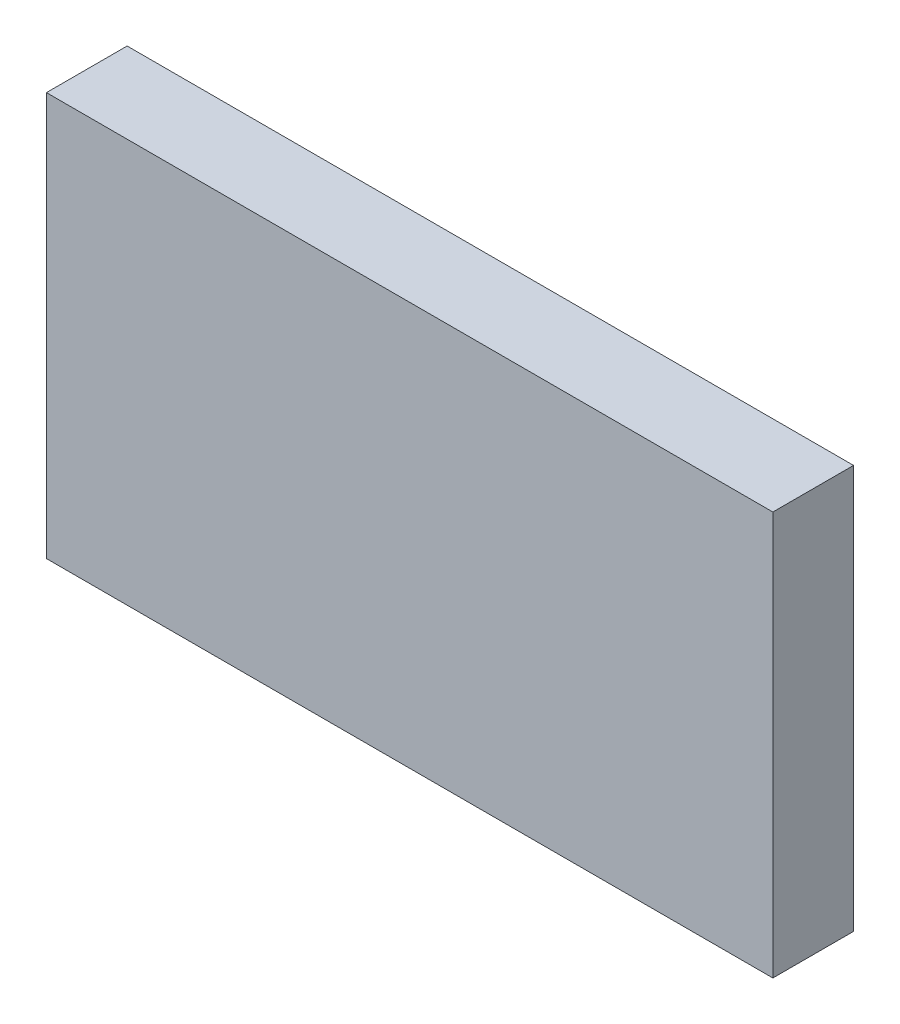
ISO-10303-21;
HEADER;
FILE_DESCRIPTION(('STEP AP214'),'2;1');
FILE_NAME('part.step','',(''),(''),'','','');
FILE_SCHEMA(('AUTOMOTIVE_DESIGN { 1 0 10303 214 1 1 1 1 }'));
ENDSEC;
DATA;
#1=APPLICATION_CONTEXT('core data for automotive mechanical design processes');
#2=APPLICATION_PROTOCOL_DEFINITION('international standard','automotive_design',2000,#1);
#3=PRODUCT_CONTEXT('',#1,'mechanical');
#4=PRODUCT('Part','Part','',(#3));
#5=PRODUCT_RELATED_PRODUCT_CATEGORY('part','',(#4));
#6=PRODUCT_DEFINITION_FORMATION('','',#4);
#7=PRODUCT_DEFINITION_CONTEXT('part definition',#1,'design');
#8=PRODUCT_DEFINITION('design','',#6,#7);
#9=PRODUCT_DEFINITION_SHAPE('','',#8);
#10=(LENGTH_UNIT() NAMED_UNIT(*) SI_UNIT(.MILLI.,.METRE.));
#11=(NAMED_UNIT(*) PLANE_ANGLE_UNIT() SI_UNIT($,.RADIAN.));
#12=(NAMED_UNIT(*) SI_UNIT($,.STERADIAN.) SOLID_ANGLE_UNIT());
#13=UNCERTAINTY_MEASURE_WITH_UNIT(LENGTH_MEASURE(1.E-05),#10,'distance_accuracy_value','');
#14=(GEOMETRIC_REPRESENTATION_CONTEXT(3) GLOBAL_UNCERTAINTY_ASSIGNED_CONTEXT((#13)) GLOBAL_UNIT_ASSIGNED_CONTEXT((#10,
#11,#12)) REPRESENTATION_CONTEXT('',''));
#15=CARTESIAN_POINT('',(0.,0.,0.));
#16=DIRECTION('',(0.,0.,1.));
#17=DIRECTION('',(1.,0.,0.));
#18=AXIS2_PLACEMENT_3D('',#15,#16,#17);
#19=CARTESIAN_POINT('',(0.,0.,10.));
#20=DIRECTION('',(1.,0.,0.));
#21=DIRECTION('',(0.,0.,-1.));
#22=AXIS2_PLACEMENT_3D('',#19,#20,#21);
#23=PLANE('',#22);
#24=DIRECTION('',(0.,-1.,0.));
#25=VECTOR('',#24,1.);
#26=CARTESIAN_POINT('',(0.,0.,0.));
#27=LINE('',#26,#25);
#28=CARTESIAN_POINT('',(0.,50.,0.));
#29=VERTEX_POINT('',#28);
#30=CARTESIAN_POINT('',(0.,0.,0.));
#31=VERTEX_POINT('',#30);
#32=EDGE_CURVE('E96',#29,#31,#27,.T.);
#33=ORIENTED_EDGE('',*,*,#32,.T.);
#34=DIRECTION('',(0.,0.,-1.));
#35=VECTOR('',#34,1.);
#36=CARTESIAN_POINT('',(0.,0.,10.));
#37=LINE('',#36,#35);
#38=CARTESIAN_POINT('',(0.,0.,10.));
#39=VERTEX_POINT('',#38);
#40=EDGE_CURVE('E11',#39,#31,#37,.T.);
#41=ORIENTED_EDGE('',*,*,#40,.F.);
#42=DIRECTION('',(0.,-1.,0.));
#43=VECTOR('',#42,1.);
#44=CARTESIAN_POINT('',(0.,0.,10.));
#45=LINE('',#44,#43);
#46=CARTESIAN_POINT('',(0.,50.,10.));
#47=VERTEX_POINT('',#46);
#48=EDGE_CURVE('E84',#47,#39,#45,.T.);
#49=ORIENTED_EDGE('',*,*,#48,.F.);
#50=DIRECTION('',(0.,0.,-1.));
#51=VECTOR('',#50,1.);
#52=CARTESIAN_POINT('',(0.,50.,10.));
#53=LINE('',#52,#51);
#54=EDGE_CURVE('E92',#47,#29,#53,.T.);
#55=ORIENTED_EDGE('',*,*,#54,.T.);
#56=EDGE_LOOP('',(#33,#41,#49,#55));
#57=FACE_BOUND('',#56,.T.);
#58=ADVANCED_FACE('F33',(#57),#23,.F.);
#59=CARTESIAN_POINT('',(0.,0.,10.));
#60=DIRECTION('',(0.,1.,0.));
#61=DIRECTION('',(0.,0.,1.));
#62=AXIS2_PLACEMENT_3D('',#59,#60,#61);
#63=PLANE('',#62);
#64=DIRECTION('',(1.,0.,0.));
#65=VECTOR('',#64,1.);
#66=CARTESIAN_POINT('',(0.,0.,0.));
#67=LINE('',#66,#65);
#68=CARTESIAN_POINT('',(90.,0.,0.));
#69=VERTEX_POINT('',#68);
#70=EDGE_CURVE('E88',#31,#69,#67,.T.);
#71=ORIENTED_EDGE('',*,*,#70,.T.);
#72=DIRECTION('',(0.,0.,-1.));
#73=VECTOR('',#72,1.);
#74=CARTESIAN_POINT('',(90.,0.,10.));
#75=LINE('',#74,#73);
#76=CARTESIAN_POINT('',(90.,0.,10.));
#77=VERTEX_POINT('',#76);
#78=EDGE_CURVE('E41',#77,#69,#75,.T.);
#79=ORIENTED_EDGE('',*,*,#78,.F.);
#80=DIRECTION('',(1.,0.,0.));
#81=VECTOR('',#80,1.);
#82=CARTESIAN_POINT('',(0.,0.,10.));
#83=LINE('',#82,#81);
#84=EDGE_CURVE('E79',#39,#77,#83,.T.);
#85=ORIENTED_EDGE('',*,*,#84,.F.);
#86=ORIENTED_EDGE('',*,*,#40,.T.);
#87=EDGE_LOOP('',(#71,#79,#85,#86));
#88=FACE_BOUND('',#87,.T.);
#89=ADVANCED_FACE('F87',(#88),#63,.F.);
#90=CARTESIAN_POINT('',(90.,0.,10.));
#91=DIRECTION('',(-1.,0.,0.));
#92=DIRECTION('',(0.,0.,1.));
#93=AXIS2_PLACEMENT_3D('',#90,#91,#92);
#94=PLANE('',#93);
#95=DIRECTION('',(0.,1.,0.));
#96=VECTOR('',#95,1.);
#97=CARTESIAN_POINT('',(90.,0.,0.));
#98=LINE('',#97,#96);
#99=CARTESIAN_POINT('',(90.,50.,0.));
#100=VERTEX_POINT('',#99);
#101=EDGE_CURVE('E66',#69,#100,#98,.T.);
#102=ORIENTED_EDGE('',*,*,#101,.T.);
#103=DIRECTION('',(0.,0.,-1.));
#104=VECTOR('',#103,1.);
#105=CARTESIAN_POINT('',(90.,50.,10.));
#106=LINE('',#105,#104);
#107=CARTESIAN_POINT('',(90.,50.,10.));
#108=VERTEX_POINT('',#107);
#109=EDGE_CURVE('E89',#108,#100,#106,.T.);
#110=ORIENTED_EDGE('',*,*,#109,.F.);
#111=DIRECTION('',(0.,1.,0.));
#112=VECTOR('',#111,1.);
#113=CARTESIAN_POINT('',(90.,0.,10.));
#114=LINE('',#113,#112);
#115=EDGE_CURVE('E82',#77,#108,#114,.T.);
#116=ORIENTED_EDGE('',*,*,#115,.F.);
#117=ORIENTED_EDGE('',*,*,#78,.T.);
#118=EDGE_LOOP('',(#102,#110,#116,#117));
#119=FACE_BOUND('',#118,.T.);
#120=ADVANCED_FACE('F90',(#119),#94,.F.);
#121=CARTESIAN_POINT('',(0.,50.,10.));
#122=DIRECTION('',(0.,-1.,0.));
#123=DIRECTION('',(0.,0.,-1.));
#124=AXIS2_PLACEMENT_3D('',#121,#122,#123);
#125=PLANE('',#124);
#126=DIRECTION('',(-1.,0.,0.));
#127=VECTOR('',#126,1.);
#128=CARTESIAN_POINT('',(0.,50.,0.));
#129=LINE('',#128,#127);
#130=EDGE_CURVE('E72',#100,#29,#129,.T.);
#131=ORIENTED_EDGE('',*,*,#130,.T.);
#132=ORIENTED_EDGE('',*,*,#54,.F.);
#133=DIRECTION('',(-1.,0.,0.));
#134=VECTOR('',#133,1.);
#135=CARTESIAN_POINT('',(0.,50.,10.));
#136=LINE('',#135,#134);
#137=EDGE_CURVE('E49',#108,#47,#136,.T.);
#138=ORIENTED_EDGE('',*,*,#137,.F.);
#139=ORIENTED_EDGE('',*,*,#109,.T.);
#140=EDGE_LOOP('',(#131,#132,#138,#139));
#141=FACE_BOUND('',#140,.T.);
#142=ADVANCED_FACE('F103',(#141),#125,.F.);
#143=CARTESIAN_POINT('',(0.,0.,10.));
#144=DIRECTION('',(0.,0.,-1.));
#145=DIRECTION('',(-1.,0.,0.));
#146=AXIS2_PLACEMENT_3D('',#143,#144,#145);
#147=PLANE('',#146);
#148=ORIENTED_EDGE('',*,*,#48,.T.);
#149=ORIENTED_EDGE('',*,*,#84,.T.);
#150=ORIENTED_EDGE('',*,*,#115,.T.);
#151=ORIENTED_EDGE('',*,*,#137,.T.);
#152=EDGE_LOOP('',(#148,#149,#150,#151));
#153=FACE_BOUND('',#152,.T.);
#154=ADVANCED_FACE('F80',(#153),#147,.F.);
#155=CARTESIAN_POINT('',(0.,0.,0.));
#156=DIRECTION('',(0.,0.,-1.));
#157=DIRECTION('',(-1.,0.,0.));
#158=AXIS2_PLACEMENT_3D('',#155,#156,#157);
#159=PLANE('',#158);
#160=ORIENTED_EDGE('',*,*,#32,.F.);
#161=ORIENTED_EDGE('',*,*,#130,.F.);
#162=ORIENTED_EDGE('',*,*,#101,.F.);
#163=ORIENTED_EDGE('',*,*,#70,.F.);
#164=EDGE_LOOP('',(#160,#161,#162,#163));
#165=FACE_BOUND('',#164,.T.);
#166=ADVANCED_FACE('F106',(#165),#159,.T.);
#167=CLOSED_SHELL('',(#58,#89,#120,#142,#154,#166));
#168=MANIFOLD_SOLID_BREP('B2',#167);
#169=ADVANCED_BREP_SHAPE_REPRESENTATION('',(#18,#168),#14);
#170=SHAPE_DEFINITION_REPRESENTATION(#9,#169);
ENDSEC;
END-ISO-10303-21;
